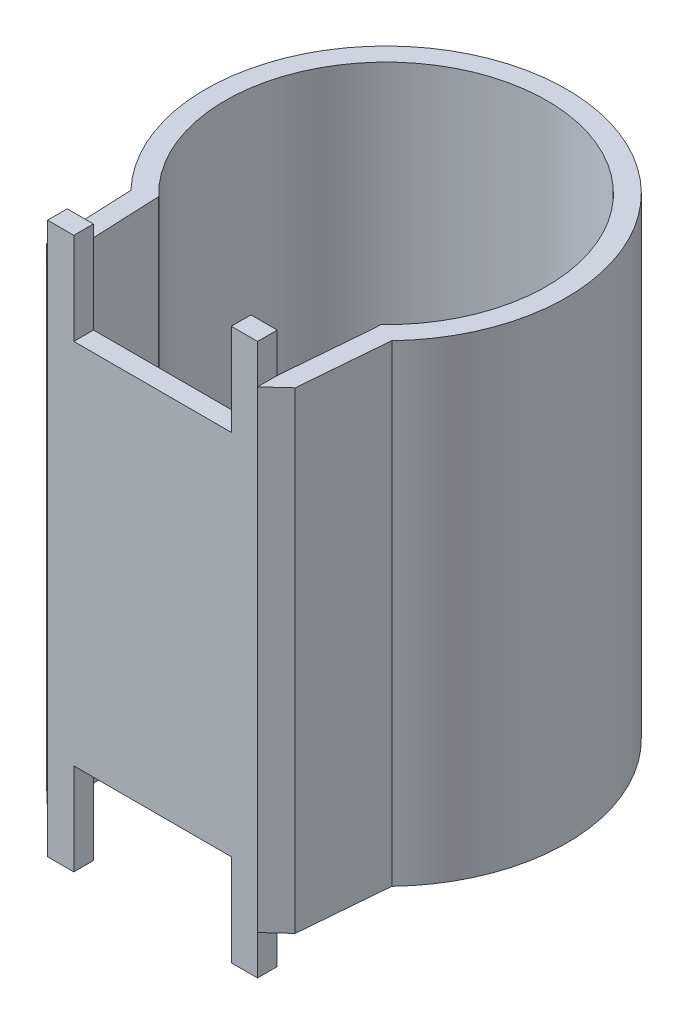
ISO-10303-21;
HEADER;
FILE_DESCRIPTION(('STEP AP214'),'2;1');
FILE_NAME('part.step','',(''),(''),'','','');
FILE_SCHEMA(('AUTOMOTIVE_DESIGN { 1 0 10303 214 1 1 1 1 }'));
ENDSEC;
DATA;
#1=APPLICATION_CONTEXT('core data for automotive mechanical design processes');
#2=APPLICATION_PROTOCOL_DEFINITION('international standard','automotive_design',2000,#1);
#3=PRODUCT_CONTEXT('',#1,'mechanical');
#4=PRODUCT('Part','Part','',(#3));
#5=PRODUCT_RELATED_PRODUCT_CATEGORY('part','',(#4));
#6=PRODUCT_DEFINITION_FORMATION('','',#4);
#7=PRODUCT_DEFINITION_CONTEXT('part definition',#1,'design');
#8=PRODUCT_DEFINITION('design','',#6,#7);
#9=PRODUCT_DEFINITION_SHAPE('','',#8);
#10=(LENGTH_UNIT() NAMED_UNIT(*) SI_UNIT(.MILLI.,.METRE.));
#11=(NAMED_UNIT(*) PLANE_ANGLE_UNIT() SI_UNIT($,.RADIAN.));
#12=(NAMED_UNIT(*) SI_UNIT($,.STERADIAN.) SOLID_ANGLE_UNIT());
#13=UNCERTAINTY_MEASURE_WITH_UNIT(LENGTH_MEASURE(1.E-05),#10,'distance_accuracy_value','');
#14=(GEOMETRIC_REPRESENTATION_CONTEXT(3) GLOBAL_UNCERTAINTY_ASSIGNED_CONTEXT((#13)) GLOBAL_UNIT_ASSIGNED_CONTEXT((#10,
#11,#12)) REPRESENTATION_CONTEXT('',''));
#15=CARTESIAN_POINT('',(0.,0.,0.));
#16=DIRECTION('',(0.,0.,1.));
#17=DIRECTION('',(1.,0.,0.));
#18=AXIS2_PLACEMENT_3D('',#15,#16,#17);
#19=CARTESIAN_POINT('',(0.,0.,0.));
#20=DIRECTION('',(0.,1.,0.));
#21=DIRECTION('',(0.,0.,1.));
#22=AXIS2_PLACEMENT_3D('',#19,#20,#21);
#23=PLANE('',#22);
#24=DIRECTION('',(-1.,0.,0.));
#25=VECTOR('',#24,1.);
#26=CARTESIAN_POINT('',(0.,0.,0.75));
#27=LINE('',#26,#25);
#28=CARTESIAN_POINT('',(8.,0.,0.749999999999999));
#29=VERTEX_POINT('',#28);
#30=CARTESIAN_POINT('',(5.99999999999999,0.,0.75));
#31=VERTEX_POINT('',#30);
#32=EDGE_CURVE('E207',#29,#31,#27,.T.);
#33=ORIENTED_EDGE('',*,*,#32,.T.);
#34=DIRECTION('',(0.,0.,-1.));
#35=VECTOR('',#34,1.);
#36=CARTESIAN_POINT('',(5.99999999999999,0.,0.));
#37=LINE('',#36,#35);
#38=CARTESIAN_POINT('',(5.99999999999999,0.,-0.750000000000001));
#39=VERTEX_POINT('',#38);
#40=EDGE_CURVE('E11',#31,#39,#37,.T.);
#41=ORIENTED_EDGE('',*,*,#40,.T.);
#42=DIRECTION('',(-1.,0.,0.));
#43=VECTOR('',#42,1.);
#44=CARTESIAN_POINT('',(0.,0.,-0.75));
#45=LINE('',#44,#43);
#46=CARTESIAN_POINT('',(8.,0.,-0.750000000000001));
#47=VERTEX_POINT('',#46);
#48=EDGE_CURVE('E216',#47,#39,#45,.T.);
#49=ORIENTED_EDGE('',*,*,#48,.F.);
#50=DIRECTION('',(0.,0.,-1.));
#51=VECTOR('',#50,1.);
#52=CARTESIAN_POINT('',(8.,0.,-0.750000000000001));
#53=LINE('',#52,#51);
#54=EDGE_CURVE('E212',#29,#47,#53,.T.);
#55=ORIENTED_EDGE('',*,*,#54,.F.);
#56=EDGE_LOOP('',(#33,#41,#49,#55));
#57=FACE_BOUND('',#56,.T.);
#58=ADVANCED_FACE('F37',(#57),#23,.F.);
#59=CARTESIAN_POINT('',(0.,42.,0.));
#60=DIRECTION('',(0.,1.,0.));
#61=DIRECTION('',(0.,0.,1.));
#62=AXIS2_PLACEMENT_3D('',#59,#60,#61);
#63=PLANE('',#62);
#64=DIRECTION('',(0.,0.,-1.));
#65=VECTOR('',#64,1.);
#66=CARTESIAN_POINT('',(5.99999999999999,42.,0.));
#67=LINE('',#66,#65);
#68=CARTESIAN_POINT('',(5.99999999999999,42.,0.75));
#69=VERTEX_POINT('',#68);
#70=CARTESIAN_POINT('',(5.99999999999999,42.,-0.750000000000001));
#71=VERTEX_POINT('',#70);
#72=EDGE_CURVE('E263',#69,#71,#67,.T.);
#73=ORIENTED_EDGE('',*,*,#72,.F.);
#74=DIRECTION('',(-1.,0.,0.));
#75=VECTOR('',#74,1.);
#76=CARTESIAN_POINT('',(0.,42.,0.75));
#77=LINE('',#76,#75);
#78=CARTESIAN_POINT('',(8.,42.,0.749999999999999));
#79=VERTEX_POINT('',#78);
#80=EDGE_CURVE('E343',#79,#69,#77,.T.);
#81=ORIENTED_EDGE('',*,*,#80,.F.);
#82=DIRECTION('',(0.,0.,1.));
#83=VECTOR('',#82,1.);
#84=CARTESIAN_POINT('',(8.,42.,-0.749999999999999));
#85=LINE('',#84,#83);
#86=CARTESIAN_POINT('',(8.,42.,-0.750000000000001));
#87=VERTEX_POINT('',#86);
#88=EDGE_CURVE('E319',#87,#79,#85,.T.);
#89=ORIENTED_EDGE('',*,*,#88,.F.);
#90=DIRECTION('',(-1.,0.,0.));
#91=VECTOR('',#90,1.);
#92=CARTESIAN_POINT('',(0.,42.,-0.75));
#93=LINE('',#92,#91);
#94=EDGE_CURVE('E220',#87,#71,#93,.T.);
#95=ORIENTED_EDGE('',*,*,#94,.T.);
#96=EDGE_LOOP('',(#73,#81,#89,#95));
#97=FACE_BOUND('',#96,.T.);
#98=ADVANCED_FACE('F397',(#97),#63,.T.);
#99=CARTESIAN_POINT('',(0.128412352704449,42.,-16.9133786398369));
#100=DIRECTION('',(0.,-1.,0.));
#101=DIRECTION('',(0.,0.,-1.));
#102=AXIS2_PLACEMENT_3D('',#99,#100,#101);
#103=CYLINDRICAL_SURFACE('',#102,12.25);
#104=DIRECTION('',(0.,-1.,0.));
#105=VECTOR('',#104,1.);
#106=CARTESIAN_POINT('',(-8.32158764729555,42.,-8.04433134038017));
#107=LINE('',#106,#105);
#108=CARTESIAN_POINT('',(-8.32158764729555,39.,-8.04433134038017));
#109=VERTEX_POINT('',#108);
#110=CARTESIAN_POINT('',(-8.32158764729555,3.,-8.04433134038017));
#111=VERTEX_POINT('',#110);
#112=EDGE_CURVE('E224',#109,#111,#107,.T.);
#113=ORIENTED_EDGE('',*,*,#112,.T.);
#114=CARTESIAN_POINT('',(0.128412352704449,3.,-16.9133786398369));
#115=DIRECTION('',(0.,-1.,0.));
#116=DIRECTION('',(0.,0.,-1.));
#117=AXIS2_PLACEMENT_3D('',#114,#115,#116);
#118=CIRCLE('',#117,12.25);
#119=CARTESIAN_POINT('',(8.57841235270445,3.,-8.04433134038017));
#120=VERTEX_POINT('',#119);
#121=EDGE_CURVE('E281',#111,#120,#118,.T.);
#122=ORIENTED_EDGE('',*,*,#121,.T.);
#123=DIRECTION('',(0.,-1.,0.));
#124=VECTOR('',#123,1.);
#125=CARTESIAN_POINT('',(8.57841235270445,42.,-8.04433134038017));
#126=LINE('',#125,#124);
#127=CARTESIAN_POINT('',(8.57841235270445,39.,-8.04433134038017));
#128=VERTEX_POINT('',#127);
#129=EDGE_CURVE('E238',#128,#120,#126,.T.);
#130=ORIENTED_EDGE('',*,*,#129,.F.);
#131=CARTESIAN_POINT('',(0.128412352704449,39.,-16.9133786398369));
#132=DIRECTION('',(0.,1.,0.));
#133=DIRECTION('',(0.,0.,1.));
#134=AXIS2_PLACEMENT_3D('',#131,#132,#133);
#135=CIRCLE('',#134,12.25);
#136=EDGE_CURVE('E322',#128,#109,#135,.T.);
#137=ORIENTED_EDGE('',*,*,#136,.T.);
#138=EDGE_LOOP('',(#113,#122,#130,#137));
#139=FACE_BOUND('',#138,.T.);
#140=ADVANCED_FACE('F378',(#139),#103,.F.);
#141=CARTESIAN_POINT('',(8.57841235270445,42.,0.));
#142=DIRECTION('',(1.,0.,0.));
#143=DIRECTION('',(0.,0.,-1.));
#144=AXIS2_PLACEMENT_3D('',#141,#142,#143);
#145=PLANE('',#144);
#146=DIRECTION('',(0.,0.,-1.));
#147=VECTOR('',#146,1.);
#148=CARTESIAN_POINT('',(8.57841235270445,3.,0.));
#149=LINE('',#148,#147);
#150=CARTESIAN_POINT('',(8.57841235270445,3.,-7.62575246303582));
#151=VERTEX_POINT('',#150);
#152=EDGE_CURVE('E297',#151,#120,#149,.T.);
#153=ORIENTED_EDGE('',*,*,#152,.F.);
#154=DIRECTION('',(0.,-1.,0.));
#155=VECTOR('',#154,1.);
#156=CARTESIAN_POINT('',(8.57841235270445,42.,-7.62575246303582));
#157=LINE('',#156,#155);
#158=CARTESIAN_POINT('',(8.57841235270445,39.,-7.62575246303582));
#159=VERTEX_POINT('',#158);
#160=EDGE_CURVE('E235',#159,#151,#157,.T.);
#161=ORIENTED_EDGE('',*,*,#160,.F.);
#162=DIRECTION('',(0.,0.,1.));
#163=VECTOR('',#162,1.);
#164=CARTESIAN_POINT('',(8.57841235270445,39.,0.));
#165=LINE('',#164,#163);
#166=EDGE_CURVE('E328',#128,#159,#165,.T.);
#167=ORIENTED_EDGE('',*,*,#166,.F.);
#168=ORIENTED_EDGE('',*,*,#129,.T.);
#169=EDGE_LOOP('',(#153,#161,#167,#168));
#170=FACE_BOUND('',#169,.T.);
#171=ADVANCED_FACE('F384',(#170),#145,.F.);
#172=CARTESIAN_POINT('',(7.88113445520582,42.,0.662988603316149));
#173=DIRECTION('',(-0.996480288635966,0.,-0.0838274081669094));
#174=DIRECTION('',(-0.0838274081669094,0.,0.996480288635966));
#175=AXIS2_PLACEMENT_3D('',#172,#173,#174);
#176=PLANE('',#175);
#177=ORIENTED_EDGE('',*,*,#160,.T.);
#178=DIRECTION('',(-0.0838274081669094,0.,0.996480288635966));
#179=VECTOR('',#178,1.);
#180=CARTESIAN_POINT('',(7.88113445520582,3.,0.662988603316149));
#181=LINE('',#180,#179);
#182=CARTESIAN_POINT('',(8.,3.,-0.750000000000001));
#183=VERTEX_POINT('',#182);
#184=EDGE_CURVE('E299',#151,#183,#181,.T.);
#185=ORIENTED_EDGE('',*,*,#184,.T.);
#186=DIRECTION('',(0.,-1.,0.));
#187=VECTOR('',#186,1.);
#188=CARTESIAN_POINT('',(8.,42.,-0.750000000000001));
#189=LINE('',#188,#187);
#190=CARTESIAN_POINT('',(8.,39.,-0.749999999999999));
#191=VERTEX_POINT('',#190);
#192=EDGE_CURVE('E231',#191,#183,#189,.T.);
#193=ORIENTED_EDGE('',*,*,#192,.F.);
#194=DIRECTION('',(0.0838274081669094,0.,-0.996480288635966));
#195=VECTOR('',#194,1.);
#196=CARTESIAN_POINT('',(7.88113445520582,39.,0.662988603316149));
#197=LINE('',#196,#195);
#198=EDGE_CURVE('E330',#191,#159,#197,.T.);
#199=ORIENTED_EDGE('',*,*,#198,.T.);
#200=EDGE_LOOP('',(#177,#185,#193,#199));
#201=FACE_BOUND('',#200,.T.);
#202=ADVANCED_FACE('F386',(#201),#176,.T.);
#203=CARTESIAN_POINT('',(9.37585488815977,42.,0.788729715566513));
#204=DIRECTION('',(-0.996480288635966,0.,-0.0838274081669094));
#205=DIRECTION('',(-0.0838274081669094,0.,0.996480288635966));
#206=AXIS2_PLACEMENT_3D('',#203,#204,#205);
#207=PLANE('',#206);
#208=DIRECTION('',(-0.0838274081669094,0.,0.996480288635966));
#209=VECTOR('',#208,1.);
#210=CARTESIAN_POINT('',(9.37585488815977,3.,0.788729715566513));
#211=LINE('',#210,#209);
#212=CARTESIAN_POINT('',(10.0655540343706,3.,-7.40992057455904));
#213=VERTEX_POINT('',#212);
#214=CARTESIAN_POINT('',(9.49472043295395,3.,-0.624258887749634));
#215=VERTEX_POINT('',#214);
#216=EDGE_CURVE('E305',#213,#215,#211,.T.);
#217=ORIENTED_EDGE('',*,*,#216,.F.);
#218=DIRECTION('',(0.,-1.,0.));
#219=VECTOR('',#218,1.);
#220=CARTESIAN_POINT('',(10.0655540343706,42.,-7.40992057455904));
#221=LINE('',#220,#219);
#222=CARTESIAN_POINT('',(10.0655540343706,39.,-7.40992057455904));
#223=VERTEX_POINT('',#222);
#224=EDGE_CURVE('E228',#223,#213,#221,.T.);
#225=ORIENTED_EDGE('',*,*,#224,.F.);
#226=DIRECTION('',(0.0838274081669094,0.,-0.996480288635966));
#227=VECTOR('',#226,1.);
#228=CARTESIAN_POINT('',(9.37585488815977,39.,0.788729715566513));
#229=LINE('',#228,#227);
#230=CARTESIAN_POINT('',(9.49472043295395,39.,-0.624258887749634));
#231=VERTEX_POINT('',#230);
#232=EDGE_CURVE('E336',#231,#223,#229,.T.);
#233=ORIENTED_EDGE('',*,*,#232,.F.);
#234=DIRECTION('',(0.,-1.,0.));
#235=VECTOR('',#234,1.);
#236=CARTESIAN_POINT('',(9.49472043295395,42.,-0.624258887749637));
#237=LINE('',#236,#235);
#238=EDGE_CURVE('E242',#231,#215,#237,.T.);
#239=ORIENTED_EDGE('',*,*,#238,.T.);
#240=EDGE_LOOP('',(#217,#225,#233,#239));
#241=FACE_BOUND('',#240,.T.);
#242=ADVANCED_FACE('F39',(#241),#207,.F.);
#243=CARTESIAN_POINT('',(0.128412352704449,42.,-16.9133786398369));
#244=DIRECTION('',(0.,-1.,0.));
#245=DIRECTION('',(0.,0.,-1.));
#246=AXIS2_PLACEMENT_3D('',#243,#244,#245);
#247=CYLINDRICAL_SURFACE('',#246,13.75);
#248=CARTESIAN_POINT('',(0.128412352704449,3.,-16.9133786398369));
#249=DIRECTION('',(0.,-1.,0.));
#250=DIRECTION('',(0.,0.,-1.));
#251=AXIS2_PLACEMENT_3D('',#248,#249,#250);
#252=CIRCLE('',#251,13.75);
#253=CARTESIAN_POINT('',(-9.79441640651934,3.,-7.39497701902252));
#254=VERTEX_POINT('',#253);
#255=EDGE_CURVE('E307',#254,#213,#252,.T.);
#256=ORIENTED_EDGE('',*,*,#255,.F.);
#257=DIRECTION('',(0.,-1.,0.));
#258=VECTOR('',#257,1.);
#259=CARTESIAN_POINT('',(-9.79441640651934,42.,-7.39497701902252));
#260=LINE('',#259,#258);
#261=CARTESIAN_POINT('',(-9.79441640651934,39.,-7.39497701902252));
#262=VERTEX_POINT('',#261);
#263=EDGE_CURVE('E255',#262,#254,#260,.T.);
#264=ORIENTED_EDGE('',*,*,#263,.F.);
#265=CARTESIAN_POINT('',(0.128412352704449,39.,-16.9133786398369));
#266=DIRECTION('',(0.,1.,0.));
#267=DIRECTION('',(0.,0.,1.));
#268=AXIS2_PLACEMENT_3D('',#265,#266,#267);
#269=CIRCLE('',#268,13.75);
#270=EDGE_CURVE('E338',#223,#262,#269,.T.);
#271=ORIENTED_EDGE('',*,*,#270,.F.);
#272=ORIENTED_EDGE('',*,*,#224,.T.);
#273=EDGE_LOOP('',(#256,#264,#271,#272));
#274=FACE_BOUND('',#273,.T.);
#275=ADVANCED_FACE('F499',(#274),#247,.T.);
#276=CARTESIAN_POINT('',(-9.45002361142424,42.,0.416626379893367));
#277=DIRECTION('',(-0.999029567776222,0.,0.0440445536798307));
#278=DIRECTION('',(0.0440445536798307,0.,0.999029567776222));
#279=AXIS2_PLACEMENT_3D('',#276,#277,#278);
#280=PLANE('',#279);
#281=ORIENTED_EDGE('',*,*,#263,.T.);
#282=DIRECTION('',(0.0440445536798307,0.,0.999029567776222));
#283=VECTOR('',#282,1.);
#284=CARTESIAN_POINT('',(-9.45002361142424,3.,0.416626379893367));
#285=LINE('',#284,#283);
#286=CARTESIAN_POINT('',(-9.49854435166433,3.,-0.683933169480253));
#287=VERTEX_POINT('',#286);
#288=EDGE_CURVE('E309',#254,#287,#285,.T.);
#289=ORIENTED_EDGE('',*,*,#288,.T.);
#290=DIRECTION('',(0.,-1.,0.));
#291=VECTOR('',#290,1.);
#292=CARTESIAN_POINT('',(-9.49854435166433,42.,-0.683933169480253));
#293=LINE('',#292,#291);
#294=CARTESIAN_POINT('',(-9.49854435166433,39.,-0.683933169480253));
#295=VERTEX_POINT('',#294);
#296=EDGE_CURVE('E252',#295,#287,#293,.T.);
#297=ORIENTED_EDGE('',*,*,#296,.F.);
#298=DIRECTION('',(-0.0440445536798307,0.,-0.999029567776222));
#299=VECTOR('',#298,1.);
#300=CARTESIAN_POINT('',(-9.45002361142424,39.,0.416626379893367));
#301=LINE('',#300,#299);
#302=EDGE_CURVE('E340',#295,#262,#301,.T.);
#303=ORIENTED_EDGE('',*,*,#302,.T.);
#304=EDGE_LOOP('',(#281,#289,#297,#303));
#305=FACE_BOUND('',#304,.T.);
#306=ADVANCED_FACE('F487',(#305),#280,.T.);
#307=CARTESIAN_POINT('',(-4.19845787319676,42.,4.38763497873483));
#308=DIRECTION('',(0.691359329987008,0.,-0.722511091153565));
#309=DIRECTION('',(-0.722511091153565,0.,-0.691359329987008));
#310=AXIS2_PLACEMENT_3D('',#307,#308,#309);
#311=PLANE('',#310);
#312=DIRECTION('',(-0.722511091153565,0.,-0.691359329987008));
#313=VECTOR('',#312,1.);
#314=CARTESIAN_POINT('',(-4.19845787319676,3.,4.38763497873483));
#315=LINE('',#314,#313);
#316=CARTESIAN_POINT('',(-8.,3.,0.75));
#317=VERTEX_POINT('',#316);
#318=EDGE_CURVE('E312',#317,#287,#315,.T.);
#319=ORIENTED_EDGE('',*,*,#318,.F.);
#320=DIRECTION('',(0.,-1.,0.));
#321=VECTOR('',#320,1.);
#322=CARTESIAN_POINT('',(-8.,42.,0.750000000000001));
#323=LINE('',#322,#321);
#324=CARTESIAN_POINT('',(-8.,39.,0.75));
#325=VERTEX_POINT('',#324);
#326=EDGE_CURVE('E248',#325,#317,#323,.T.);
#327=ORIENTED_EDGE('',*,*,#326,.F.);
#328=DIRECTION('',(0.722511091153565,0.,0.691359329987008));
#329=VECTOR('',#328,1.);
#330=CARTESIAN_POINT('',(-4.19845787319676,39.,4.38763497873483));
#331=LINE('',#330,#329);
#332=EDGE_CURVE('E218',#295,#325,#331,.T.);
#333=ORIENTED_EDGE('',*,*,#332,.F.);
#334=ORIENTED_EDGE('',*,*,#296,.T.);
#335=EDGE_LOOP('',(#319,#327,#333,#334));
#336=FACE_BOUND('',#335,.T.);
#337=ADVANCED_FACE('F489',(#336),#311,.F.);
#338=CARTESIAN_POINT('',(4.03837047557085,42.,4.39235643260646));
#339=DIRECTION('',(0.676820726571332,0.,0.736147881939121));
#340=DIRECTION('',(0.736147881939121,0.,-0.676820726571332));
#341=AXIS2_PLACEMENT_3D('',#338,#339,#340);
#342=PLANE('',#341);
#343=DIRECTION('',(0.,-1.,0.));
#344=VECTOR('',#343,1.);
#345=CARTESIAN_POINT('',(8.,42.,0.749999999999999));
#346=LINE('',#345,#344);
#347=CARTESIAN_POINT('',(8.,39.,0.749999999999999));
#348=VERTEX_POINT('',#347);
#349=CARTESIAN_POINT('',(8.,3.,0.749999999999999));
#350=VERTEX_POINT('',#349);
#351=EDGE_CURVE('E245',#348,#350,#346,.T.);
#352=ORIENTED_EDGE('',*,*,#351,.T.);
#353=DIRECTION('',(0.736147881939121,0.,-0.676820726571332));
#354=VECTOR('',#353,1.);
#355=CARTESIAN_POINT('',(4.03837047557085,3.,4.39235643260646));
#356=LINE('',#355,#354);
#357=EDGE_CURVE('E302',#350,#215,#356,.T.);
#358=ORIENTED_EDGE('',*,*,#357,.T.);
#359=ORIENTED_EDGE('',*,*,#238,.F.);
#360=DIRECTION('',(-0.736147881939121,0.,0.676820726571332));
#361=VECTOR('',#360,1.);
#362=CARTESIAN_POINT('',(4.03837047557085,39.,4.39235643260646));
#363=LINE('',#362,#361);
#364=EDGE_CURVE('E333',#231,#348,#363,.T.);
#365=ORIENTED_EDGE('',*,*,#364,.T.);
#366=EDGE_LOOP('',(#352,#358,#359,#365));
#367=FACE_BOUND('',#366,.T.);
#368=ADVANCED_FACE('F491',(#367),#342,.T.);
#369=CARTESIAN_POINT('',(-7.95147925975991,42.,0.350559549373621));
#370=DIRECTION('',(-0.999029567776222,0.,0.0440445536798307));
#371=DIRECTION('',(0.0440445536798307,0.,0.999029567776222));
#372=AXIS2_PLACEMENT_3D('',#369,#370,#371);
#373=PLANE('',#372);
#374=DIRECTION('',(0.0440445536798307,0.,0.999029567776222));
#375=VECTOR('',#374,1.);
#376=CARTESIAN_POINT('',(-7.95147925975991,3.,0.350559549373621));
#377=LINE('',#376,#375);
#378=CARTESIAN_POINT('',(-8.,3.,-0.750000000000001));
#379=VERTEX_POINT('',#378);
#380=EDGE_CURVE('E278',#111,#379,#377,.T.);
#381=ORIENTED_EDGE('',*,*,#380,.F.);
#382=ORIENTED_EDGE('',*,*,#112,.F.);
#383=DIRECTION('',(-0.0440445536798307,0.,-0.999029567776222));
#384=VECTOR('',#383,1.);
#385=CARTESIAN_POINT('',(-7.95147925975991,39.,0.350559549373621));
#386=LINE('',#385,#384);
#387=CARTESIAN_POINT('',(-8.,39.,-0.749999999999999));
#388=VERTEX_POINT('',#387);
#389=EDGE_CURVE('E241',#388,#109,#386,.T.);
#390=ORIENTED_EDGE('',*,*,#389,.F.);
#391=DIRECTION('',(0.,-1.,0.));
#392=VECTOR('',#391,1.);
#393=CARTESIAN_POINT('',(-8.,42.,-0.749999999999999));
#394=LINE('',#393,#392);
#395=EDGE_CURVE('E227',#388,#379,#394,.T.);
#396=ORIENTED_EDGE('',*,*,#395,.T.);
#397=EDGE_LOOP('',(#381,#382,#390,#396));
#398=FACE_BOUND('',#397,.T.);
#399=ADVANCED_FACE('F376',(#398),#373,.F.);
#400=CARTESIAN_POINT('',(0.,42.,-0.75));
#401=DIRECTION('',(0.,0.,1.));
#402=DIRECTION('',(1.,0.,0.));
#403=AXIS2_PLACEMENT_3D('',#400,#401,#402);
#404=PLANE('',#403);
#405=ORIENTED_EDGE('',*,*,#48,.T.);
#406=DIRECTION('',(0.,1.,0.));
#407=VECTOR('',#406,1.);
#408=CARTESIAN_POINT('',(5.99999999999999,42.,-0.750000000000001));
#409=LINE('',#408,#407);
#410=CARTESIAN_POINT('',(5.99999999999999,7.00000000000001,-0.750000000000001));
#411=VERTEX_POINT('',#410);
#412=EDGE_CURVE('E198',#39,#411,#409,.T.);
#413=ORIENTED_EDGE('',*,*,#412,.T.);
#414=DIRECTION('',(-1.,0.,0.));
#415=VECTOR('',#414,1.);
#416=CARTESIAN_POINT('',(0.,7.00000000000001,-0.75));
#417=LINE('',#416,#415);
#418=CARTESIAN_POINT('',(-6.,7.00000000000001,-0.749999999999999));
#419=VERTEX_POINT('',#418);
#420=EDGE_CURVE('E420',#411,#419,#417,.T.);
#421=ORIENTED_EDGE('',*,*,#420,.T.);
#422=DIRECTION('',(0.,-1.,0.));
#423=VECTOR('',#422,1.);
#424=CARTESIAN_POINT('',(-5.99999999999999,42.,-0.749999999999999));
#425=LINE('',#424,#423);
#426=CARTESIAN_POINT('',(-6.00000000000001,0.,-0.750000000000001));
#427=VERTEX_POINT('',#426);
#428=EDGE_CURVE('E419',#419,#427,#425,.T.);
#429=ORIENTED_EDGE('',*,*,#428,.T.);
#430=CARTESIAN_POINT('',(-8.,0.,-0.750000000000001));
#431=VERTEX_POINT('',#430);
#432=EDGE_CURVE('E213',#427,#431,#45,.T.);
#433=ORIENTED_EDGE('',*,*,#432,.T.);
#434=DIRECTION('',(0.,-1.,0.));
#435=VECTOR('',#434,1.);
#436=CARTESIAN_POINT('',(-8.,3.,-0.750000000000001));
#437=LINE('',#436,#435);
#438=EDGE_CURVE('E279',#379,#431,#437,.T.);
#439=ORIENTED_EDGE('',*,*,#438,.F.);
#440=ORIENTED_EDGE('',*,*,#395,.F.);
#441=CARTESIAN_POINT('',(-8.,42.,-0.749999999999999));
#442=VERTEX_POINT('',#441);
#443=EDGE_CURVE('E229',#442,#388,#394,.T.);
#444=ORIENTED_EDGE('',*,*,#443,.F.);
#445=CARTESIAN_POINT('',(-6.00000000000001,42.,-0.749999999999999));
#446=VERTEX_POINT('',#445);
#447=EDGE_CURVE('E345',#446,#442,#93,.T.);
#448=ORIENTED_EDGE('',*,*,#447,.F.);
#449=DIRECTION('',(0.,-1.,0.));
#450=VECTOR('',#449,1.);
#451=CARTESIAN_POINT('',(-6.00000000000001,42.,-0.749999999999999));
#452=LINE('',#451,#450);
#453=CARTESIAN_POINT('',(-6.,35.,-0.749999999999999));
#454=VERTEX_POINT('',#453);
#455=EDGE_CURVE('E60',#446,#454,#452,.T.);
#456=ORIENTED_EDGE('',*,*,#455,.T.);
#457=DIRECTION('',(1.,0.,0.));
#458=VECTOR('',#457,1.);
#459=CARTESIAN_POINT('',(0.,35.,-0.75));
#460=LINE('',#459,#458);
#461=CARTESIAN_POINT('',(5.99999999999999,35.,-0.75));
#462=VERTEX_POINT('',#461);
#463=EDGE_CURVE('E406',#454,#462,#460,.T.);
#464=ORIENTED_EDGE('',*,*,#463,.T.);
#465=DIRECTION('',(0.,1.,0.));
#466=VECTOR('',#465,1.);
#467=CARTESIAN_POINT('',(5.99999999999999,42.,-0.750000000000001));
#468=LINE('',#467,#466);
#469=EDGE_CURVE('E403',#462,#71,#468,.T.);
#470=ORIENTED_EDGE('',*,*,#469,.T.);
#471=ORIENTED_EDGE('',*,*,#94,.F.);
#472=EDGE_CURVE('E232',#87,#191,#189,.T.);
#473=ORIENTED_EDGE('',*,*,#472,.T.);
#474=ORIENTED_EDGE('',*,*,#192,.T.);
#475=DIRECTION('',(0.,-1.,0.));
#476=VECTOR('',#475,1.);
#477=CARTESIAN_POINT('',(8.,3.,-0.750000000000001));
#478=LINE('',#477,#476);
#479=EDGE_CURVE('E284',#183,#47,#478,.T.);
#480=ORIENTED_EDGE('',*,*,#479,.T.);
#481=EDGE_LOOP('',(#405,#413,#421,#429,#433,#439,#440,#444,#448,#456,#464,#470,#471,#473,#474,#480));
#482=FACE_BOUND('',#481,.T.);
#483=ADVANCED_FACE('F364',(#482),#404,.F.);
#484=CARTESIAN_POINT('',(0.,42.,0.75));
#485=DIRECTION('',(0.,0.,1.));
#486=DIRECTION('',(1.,0.,0.));
#487=AXIS2_PLACEMENT_3D('',#484,#485,#486);
#488=PLANE('',#487);
#489=DIRECTION('',(0.,1.,0.));
#490=VECTOR('',#489,1.);
#491=CARTESIAN_POINT('',(5.99999999999999,3.00000000000002,0.75));
#492=LINE('',#491,#490);
#493=CARTESIAN_POINT('',(5.99999999999999,7.00000000000001,0.75));
#494=VERTEX_POINT('',#493);
#495=EDGE_CURVE('E195',#31,#494,#492,.T.);
#496=ORIENTED_EDGE('',*,*,#495,.F.);
#497=ORIENTED_EDGE('',*,*,#32,.F.);
#498=DIRECTION('',(0.,-1.,0.));
#499=VECTOR('',#498,1.);
#500=CARTESIAN_POINT('',(8.,3.,0.749999999999999));
#501=LINE('',#500,#499);
#502=EDGE_CURVE('E292',#350,#29,#501,.T.);
#503=ORIENTED_EDGE('',*,*,#502,.F.);
#504=ORIENTED_EDGE('',*,*,#351,.F.);
#505=EDGE_CURVE('E246',#79,#348,#346,.T.);
#506=ORIENTED_EDGE('',*,*,#505,.F.);
#507=ORIENTED_EDGE('',*,*,#80,.T.);
#508=DIRECTION('',(0.,1.,0.));
#509=VECTOR('',#508,1.);
#510=CARTESIAN_POINT('',(5.99999999999999,39.,0.75));
#511=LINE('',#510,#509);
#512=CARTESIAN_POINT('',(5.99999999999999,35.,0.75));
#513=VERTEX_POINT('',#512);
#514=EDGE_CURVE('E405',#513,#69,#511,.T.);
#515=ORIENTED_EDGE('',*,*,#514,.F.);
#516=DIRECTION('',(1.,0.,0.));
#517=VECTOR('',#516,1.);
#518=CARTESIAN_POINT('',(-6.,35.,0.75));
#519=LINE('',#518,#517);
#520=CARTESIAN_POINT('',(-6.,35.,0.75));
#521=VERTEX_POINT('',#520);
#522=EDGE_CURVE('E431',#521,#513,#519,.T.);
#523=ORIENTED_EDGE('',*,*,#522,.F.);
#524=DIRECTION('',(0.,-1.,0.));
#525=VECTOR('',#524,1.);
#526=CARTESIAN_POINT('',(-6.,39.,0.75));
#527=LINE('',#526,#525);
#528=CARTESIAN_POINT('',(-6.00000000000001,42.,0.75));
#529=VERTEX_POINT('',#528);
#530=EDGE_CURVE('E354',#529,#521,#527,.T.);
#531=ORIENTED_EDGE('',*,*,#530,.F.);
#532=CARTESIAN_POINT('',(-8.,42.,0.75));
#533=VERTEX_POINT('',#532);
#534=EDGE_CURVE('E223',#529,#533,#77,.T.);
#535=ORIENTED_EDGE('',*,*,#534,.T.);
#536=EDGE_CURVE('E249',#533,#325,#323,.T.);
#537=ORIENTED_EDGE('',*,*,#536,.T.);
#538=ORIENTED_EDGE('',*,*,#326,.T.);
#539=DIRECTION('',(0.,-1.,0.));
#540=VECTOR('',#539,1.);
#541=CARTESIAN_POINT('',(-8.,3.,0.75));
#542=LINE('',#541,#540);
#543=CARTESIAN_POINT('',(-8.,0.,0.75));
#544=VERTEX_POINT('',#543);
#545=EDGE_CURVE('E273',#317,#544,#542,.T.);
#546=ORIENTED_EDGE('',*,*,#545,.T.);
#547=CARTESIAN_POINT('',(-6.00000000000001,0.,0.750000000000001));
#548=VERTEX_POINT('',#547);
#549=EDGE_CURVE('E214',#548,#544,#27,.T.);
#550=ORIENTED_EDGE('',*,*,#549,.F.);
#551=DIRECTION('',(0.,-1.,0.));
#552=VECTOR('',#551,1.);
#553=CARTESIAN_POINT('',(-6.,3.00000000000002,0.75));
#554=LINE('',#553,#552);
#555=CARTESIAN_POINT('',(-6.,7.00000000000001,0.75));
#556=VERTEX_POINT('',#555);
#557=EDGE_CURVE('E52',#556,#548,#554,.T.);
#558=ORIENTED_EDGE('',*,*,#557,.F.);
#559=DIRECTION('',(-1.,0.,0.));
#560=VECTOR('',#559,1.);
#561=CARTESIAN_POINT('',(-6.,7.00000000000001,0.75));
#562=LINE('',#561,#560);
#563=EDGE_CURVE('E209',#494,#556,#562,.T.);
#564=ORIENTED_EDGE('',*,*,#563,.F.);
#565=EDGE_LOOP('',(#496,#497,#503,#504,#506,#507,#515,#523,#531,#535,#537,#538,#546,#550,#558,#564));
#566=FACE_BOUND('',#565,.T.);
#567=ADVANCED_FACE('F205',(#566),#488,.T.);
#568=DIRECTION('',(0.,0.,1.));
#569=VECTOR('',#568,1.);
#570=CARTESIAN_POINT('',(-6.00000000000001,42.,0.));
#571=LINE('',#570,#569);
#572=EDGE_CURVE('E261',#446,#529,#571,.T.);
#573=ORIENTED_EDGE('',*,*,#572,.F.);
#574=ORIENTED_EDGE('',*,*,#447,.T.);
#575=DIRECTION('',(0.,0.,-1.));
#576=VECTOR('',#575,1.);
#577=CARTESIAN_POINT('',(-8.,42.,-0.749999999999999));
#578=LINE('',#577,#576);
#579=EDGE_CURVE('E314',#533,#442,#578,.T.);
#580=ORIENTED_EDGE('',*,*,#579,.F.);
#581=ORIENTED_EDGE('',*,*,#534,.F.);
#582=EDGE_LOOP('',(#573,#574,#580,#581));
#583=FACE_BOUND('',#582,.T.);
#584=ADVANCED_FACE('F361',(#583),#63,.T.);
#585=ORIENTED_EDGE('',*,*,#432,.F.);
#586=DIRECTION('',(0.,0.,1.));
#587=VECTOR('',#586,1.);
#588=CARTESIAN_POINT('',(-6.00000000000001,0.,0.));
#589=LINE('',#588,#587);
#590=EDGE_CURVE('E45',#427,#548,#589,.T.);
#591=ORIENTED_EDGE('',*,*,#590,.T.);
#592=ORIENTED_EDGE('',*,*,#549,.T.);
#593=DIRECTION('',(0.,0.,1.));
#594=VECTOR('',#593,1.);
#595=CARTESIAN_POINT('',(-8.,0.,-0.750000000000001));
#596=LINE('',#595,#594);
#597=EDGE_CURVE('E287',#431,#544,#596,.T.);
#598=ORIENTED_EDGE('',*,*,#597,.F.);
#599=EDGE_LOOP('',(#585,#591,#592,#598));
#600=FACE_BOUND('',#599,.T.);
#601=ADVANCED_FACE('F267',(#600),#23,.F.);
#602=CARTESIAN_POINT('',(0.,39.,0.));
#603=DIRECTION('',(0.,1.,0.));
#604=DIRECTION('',(0.,0.,1.));
#605=AXIS2_PLACEMENT_3D('',#602,#603,#604);
#606=PLANE('',#605);
#607=ORIENTED_EDGE('',*,*,#332,.T.);
#608=DIRECTION('',(0.,0.,-1.));
#609=VECTOR('',#608,1.);
#610=CARTESIAN_POINT('',(-8.,39.,-0.749999999999999));
#611=LINE('',#610,#609);
#612=EDGE_CURVE('E315',#325,#388,#611,.T.);
#613=ORIENTED_EDGE('',*,*,#612,.T.);
#614=ORIENTED_EDGE('',*,*,#389,.T.);
#615=ORIENTED_EDGE('',*,*,#136,.F.);
#616=ORIENTED_EDGE('',*,*,#166,.T.);
#617=ORIENTED_EDGE('',*,*,#198,.F.);
#618=DIRECTION('',(0.,0.,1.));
#619=VECTOR('',#618,1.);
#620=CARTESIAN_POINT('',(8.,39.,-0.749999999999999));
#621=LINE('',#620,#619);
#622=EDGE_CURVE('E318',#191,#348,#621,.T.);
#623=ORIENTED_EDGE('',*,*,#622,.T.);
#624=ORIENTED_EDGE('',*,*,#364,.F.);
#625=ORIENTED_EDGE('',*,*,#232,.T.);
#626=ORIENTED_EDGE('',*,*,#270,.T.);
#627=ORIENTED_EDGE('',*,*,#302,.F.);
#628=EDGE_LOOP('',(#607,#613,#614,#615,#616,#617,#623,#624,#625,#626,#627));
#629=FACE_BOUND('',#628,.T.);
#630=ADVANCED_FACE('F371',(#629),#606,.T.);
#631=CARTESIAN_POINT('',(-8.,39.,-0.749999999999999));
#632=DIRECTION('',(1.,0.,0.));
#633=DIRECTION('',(0.,0.,-1.));
#634=AXIS2_PLACEMENT_3D('',#631,#632,#633);
#635=PLANE('',#634);
#636=ORIENTED_EDGE('',*,*,#579,.T.);
#637=ORIENTED_EDGE('',*,*,#443,.T.);
#638=ORIENTED_EDGE('',*,*,#612,.F.);
#639=ORIENTED_EDGE('',*,*,#536,.F.);
#640=EDGE_LOOP('',(#636,#637,#638,#639));
#641=FACE_BOUND('',#640,.T.);
#642=ADVANCED_FACE('F359',(#641),#635,.F.);
#643=CARTESIAN_POINT('',(8.,39.,-0.749999999999999));
#644=DIRECTION('',(-1.,0.,0.));
#645=DIRECTION('',(0.,0.,1.));
#646=AXIS2_PLACEMENT_3D('',#643,#644,#645);
#647=PLANE('',#646);
#648=ORIENTED_EDGE('',*,*,#88,.T.);
#649=ORIENTED_EDGE('',*,*,#505,.T.);
#650=ORIENTED_EDGE('',*,*,#622,.F.);
#651=ORIENTED_EDGE('',*,*,#472,.F.);
#652=EDGE_LOOP('',(#648,#649,#650,#651));
#653=FACE_BOUND('',#652,.T.);
#654=ADVANCED_FACE('F391',(#653),#647,.F.);
#655=CARTESIAN_POINT('',(0.,3.,0.));
#656=DIRECTION('',(0.,-1.,0.));
#657=DIRECTION('',(0.,0.,-1.));
#658=AXIS2_PLACEMENT_3D('',#655,#656,#657);
#659=PLANE('',#658);
#660=ORIENTED_EDGE('',*,*,#318,.T.);
#661=ORIENTED_EDGE('',*,*,#288,.F.);
#662=ORIENTED_EDGE('',*,*,#255,.T.);
#663=ORIENTED_EDGE('',*,*,#216,.T.);
#664=ORIENTED_EDGE('',*,*,#357,.F.);
#665=DIRECTION('',(0.,0.,-1.));
#666=VECTOR('',#665,1.);
#667=CARTESIAN_POINT('',(8.,3.,-0.750000000000001));
#668=LINE('',#667,#666);
#669=EDGE_CURVE('E413',#350,#183,#668,.T.);
#670=ORIENTED_EDGE('',*,*,#669,.T.);
#671=ORIENTED_EDGE('',*,*,#184,.F.);
#672=ORIENTED_EDGE('',*,*,#152,.T.);
#673=ORIENTED_EDGE('',*,*,#121,.F.);
#674=ORIENTED_EDGE('',*,*,#380,.T.);
#675=DIRECTION('',(0.,0.,1.));
#676=VECTOR('',#675,1.);
#677=CARTESIAN_POINT('',(-8.,3.,-0.750000000000001));
#678=LINE('',#677,#676);
#679=EDGE_CURVE('E293',#379,#317,#678,.T.);
#680=ORIENTED_EDGE('',*,*,#679,.T.);
#681=EDGE_LOOP('',(#660,#661,#662,#663,#664,#670,#671,#672,#673,#674,#680));
#682=FACE_BOUND('',#681,.T.);
#683=ADVANCED_FACE('F472',(#682),#659,.T.);
#684=CARTESIAN_POINT('',(-8.,3.,-0.750000000000001));
#685=DIRECTION('',(1.,0.,0.));
#686=DIRECTION('',(0.,0.,-1.));
#687=AXIS2_PLACEMENT_3D('',#684,#685,#686);
#688=PLANE('',#687);
#689=ORIENTED_EDGE('',*,*,#597,.T.);
#690=ORIENTED_EDGE('',*,*,#545,.F.);
#691=ORIENTED_EDGE('',*,*,#679,.F.);
#692=ORIENTED_EDGE('',*,*,#438,.T.);
#693=EDGE_LOOP('',(#689,#690,#691,#692));
#694=FACE_BOUND('',#693,.T.);
#695=ADVANCED_FACE('F417',(#694),#688,.F.);
#696=CARTESIAN_POINT('',(8.,3.,-0.750000000000001));
#697=DIRECTION('',(-1.,0.,0.));
#698=DIRECTION('',(0.,0.,1.));
#699=AXIS2_PLACEMENT_3D('',#696,#697,#698);
#700=PLANE('',#699);
#701=ORIENTED_EDGE('',*,*,#54,.T.);
#702=ORIENTED_EDGE('',*,*,#479,.F.);
#703=ORIENTED_EDGE('',*,*,#669,.F.);
#704=ORIENTED_EDGE('',*,*,#502,.T.);
#705=EDGE_LOOP('',(#701,#702,#703,#704));
#706=FACE_BOUND('',#705,.T.);
#707=ADVANCED_FACE('F474',(#706),#700,.F.);
#708=CARTESIAN_POINT('',(-6.,35.,-1.25));
#709=DIRECTION('',(0.,-1.,0.));
#710=DIRECTION('',(0.,0.,-1.));
#711=AXIS2_PLACEMENT_3D('',#708,#709,#710);
#712=PLANE('',#711);
#713=DIRECTION('',(0.,0.,1.));
#714=VECTOR('',#713,1.);
#715=CARTESIAN_POINT('',(-6.,35.,-1.25));
#716=LINE('',#715,#714);
#717=EDGE_CURVE('E435',#454,#521,#716,.T.);
#718=ORIENTED_EDGE('',*,*,#717,.T.);
#719=ORIENTED_EDGE('',*,*,#522,.T.);
#720=DIRECTION('',(0.,0.,1.));
#721=VECTOR('',#720,1.);
#722=CARTESIAN_POINT('',(5.99999999999999,35.,-1.25));
#723=LINE('',#722,#721);
#724=EDGE_CURVE('E409',#462,#513,#723,.T.);
#725=ORIENTED_EDGE('',*,*,#724,.F.);
#726=ORIENTED_EDGE('',*,*,#463,.F.);
#727=EDGE_LOOP('',(#718,#719,#725,#726));
#728=FACE_BOUND('',#727,.T.);
#729=ADVANCED_FACE('F437',(#728),#712,.F.);
#730=CARTESIAN_POINT('',(5.99999999999999,39.,-1.25));
#731=DIRECTION('',(1.,0.,0.));
#732=DIRECTION('',(0.,0.,-1.));
#733=AXIS2_PLACEMENT_3D('',#730,#731,#732);
#734=PLANE('',#733);
#735=ORIENTED_EDGE('',*,*,#724,.T.);
#736=ORIENTED_EDGE('',*,*,#514,.T.);
#737=ORIENTED_EDGE('',*,*,#72,.T.);
#738=ORIENTED_EDGE('',*,*,#469,.F.);
#739=EDGE_LOOP('',(#735,#736,#737,#738));
#740=FACE_BOUND('',#739,.T.);
#741=ADVANCED_FACE('F402',(#740),#734,.F.);
#742=CARTESIAN_POINT('',(-6.,39.,-1.25));
#743=DIRECTION('',(-1.,0.,0.));
#744=DIRECTION('',(0.,-1.,0.));
#745=AXIS2_PLACEMENT_3D('',#742,#743,#744);
#746=PLANE('',#745);
#747=ORIENTED_EDGE('',*,*,#572,.T.);
#748=ORIENTED_EDGE('',*,*,#530,.T.);
#749=ORIENTED_EDGE('',*,*,#717,.F.);
#750=ORIENTED_EDGE('',*,*,#455,.F.);
#751=EDGE_LOOP('',(#747,#748,#749,#750));
#752=FACE_BOUND('',#751,.T.);
#753=ADVANCED_FACE('F438',(#752),#746,.F.);
#754=CARTESIAN_POINT('',(-6.,7.00000000000001,-1.25));
#755=DIRECTION('',(0.,1.,0.));
#756=DIRECTION('',(0.,0.,1.));
#757=AXIS2_PLACEMENT_3D('',#754,#755,#756);
#758=PLANE('',#757);
#759=DIRECTION('',(0.,0.,1.));
#760=VECTOR('',#759,1.);
#761=CARTESIAN_POINT('',(5.99999999999999,7.00000000000001,-1.25));
#762=LINE('',#761,#760);
#763=EDGE_CURVE('E425',#411,#494,#762,.T.);
#764=ORIENTED_EDGE('',*,*,#763,.T.);
#765=ORIENTED_EDGE('',*,*,#563,.T.);
#766=DIRECTION('',(0.,0.,1.));
#767=VECTOR('',#766,1.);
#768=CARTESIAN_POINT('',(-6.,7.00000000000001,-1.25));
#769=LINE('',#768,#767);
#770=EDGE_CURVE('E422',#419,#556,#769,.T.);
#771=ORIENTED_EDGE('',*,*,#770,.F.);
#772=ORIENTED_EDGE('',*,*,#420,.F.);
#773=EDGE_LOOP('',(#764,#765,#771,#772));
#774=FACE_BOUND('',#773,.T.);
#775=ADVANCED_FACE('F440',(#774),#758,.F.);
#776=CARTESIAN_POINT('',(5.99999999999999,3.00000000000002,-1.25));
#777=DIRECTION('',(1.,0.,0.));
#778=DIRECTION('',(0.,0.,-1.));
#779=AXIS2_PLACEMENT_3D('',#776,#777,#778);
#780=PLANE('',#779);
#781=ORIENTED_EDGE('',*,*,#40,.F.);
#782=ORIENTED_EDGE('',*,*,#495,.T.);
#783=ORIENTED_EDGE('',*,*,#763,.F.);
#784=ORIENTED_EDGE('',*,*,#412,.F.);
#785=EDGE_LOOP('',(#781,#782,#783,#784));
#786=FACE_BOUND('',#785,.T.);
#787=ADVANCED_FACE('F193',(#786),#780,.F.);
#788=CARTESIAN_POINT('',(-6.,3.00000000000002,-1.25));
#789=DIRECTION('',(-1.,0.,0.));
#790=DIRECTION('',(0.,-1.,0.));
#791=AXIS2_PLACEMENT_3D('',#788,#789,#790);
#792=PLANE('',#791);
#793=ORIENTED_EDGE('',*,*,#770,.T.);
#794=ORIENTED_EDGE('',*,*,#557,.T.);
#795=ORIENTED_EDGE('',*,*,#590,.F.);
#796=ORIENTED_EDGE('',*,*,#428,.F.);
#797=EDGE_LOOP('',(#793,#794,#795,#796));
#798=FACE_BOUND('',#797,.T.);
#799=ADVANCED_FACE('F653',(#798),#792,.F.);
#800=CLOSED_SHELL('',(#58,#98,#140,#171,#202,#242,#275,#306,#337,#368,#399,#483,#567,#584,#601,
#630,#642,#654,#683,#695,#707,#729,#741,#753,#775,#787,#799));
#801=MANIFOLD_SOLID_BREP('B2',#800);
#802=ADVANCED_BREP_SHAPE_REPRESENTATION('',(#18,#801),#14);
#803=SHAPE_DEFINITION_REPRESENTATION(#9,#802);
ENDSEC;
END-ISO-10303-21;
